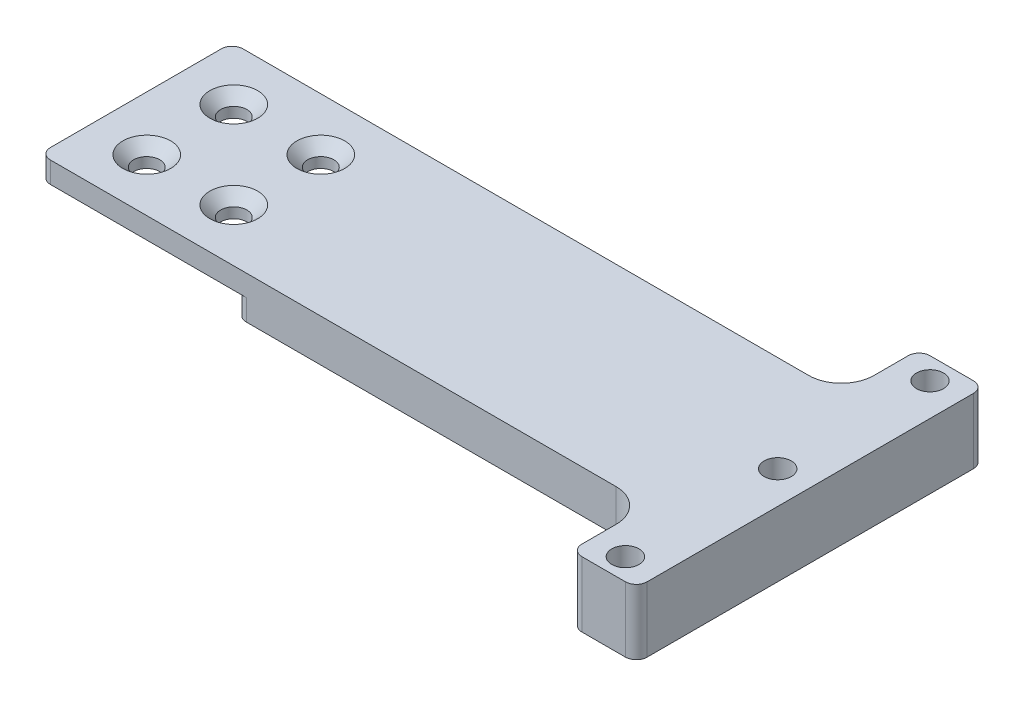
ISO-10303-21;
HEADER;
FILE_DESCRIPTION(('STEP AP214'),'2;1');
FILE_NAME('part.step','',(''),(''),'','','');
FILE_SCHEMA(('AUTOMOTIVE_DESIGN { 1 0 10303 214 1 1 1 1 }'));
ENDSEC;
DATA;
#1=APPLICATION_CONTEXT('core data for automotive mechanical design processes');
#2=APPLICATION_PROTOCOL_DEFINITION('international standard','automotive_design',2000,#1);
#3=PRODUCT_CONTEXT('',#1,'mechanical');
#4=PRODUCT('Part','Part','',(#3));
#5=PRODUCT_RELATED_PRODUCT_CATEGORY('part','',(#4));
#6=PRODUCT_DEFINITION_FORMATION('','',#4);
#7=PRODUCT_DEFINITION_CONTEXT('part definition',#1,'design');
#8=PRODUCT_DEFINITION('design','',#6,#7);
#9=PRODUCT_DEFINITION_SHAPE('','',#8);
#10=(LENGTH_UNIT() NAMED_UNIT(*) SI_UNIT(.MILLI.,.METRE.));
#11=(NAMED_UNIT(*) PLANE_ANGLE_UNIT() SI_UNIT($,.RADIAN.));
#12=(NAMED_UNIT(*) SI_UNIT($,.STERADIAN.) SOLID_ANGLE_UNIT());
#13=UNCERTAINTY_MEASURE_WITH_UNIT(LENGTH_MEASURE(1.E-05),#10,'distance_accuracy_value','');
#14=(GEOMETRIC_REPRESENTATION_CONTEXT(3) GLOBAL_UNCERTAINTY_ASSIGNED_CONTEXT((#13)) GLOBAL_UNIT_ASSIGNED_CONTEXT((#10,
#11,#12)) REPRESENTATION_CONTEXT('',''));
#15=CARTESIAN_POINT('',(0.,0.,0.));
#16=DIRECTION('',(0.,0.,1.));
#17=DIRECTION('',(1.,0.,0.));
#18=AXIS2_PLACEMENT_3D('',#15,#16,#17);
#19=CARTESIAN_POINT('',(-26.,3.9,4.));
#20=DIRECTION('',(0.,1.,0.));
#21=DIRECTION('',(0.,0.,1.));
#22=AXIS2_PLACEMENT_3D('',#19,#20,#21);
#23=CYLINDRICAL_SURFACE('',#22,1.2);
#24=CARTESIAN_POINT('',(-26.,2.9,4.));
#25=DIRECTION('',(0.,1.,0.));
#26=DIRECTION('',(0.,0.,1.));
#27=AXIS2_PLACEMENT_3D('',#24,#25,#26);
#28=CIRCLE('',#27,1.2);
#29=CARTESIAN_POINT('',(-26.,2.9,5.2));
#30=VERTEX_POINT('',#29);
#31=EDGE_CURVE('E213',#30,#30,#28,.T.);
#32=ORIENTED_EDGE('',*,*,#31,.T.);
#33=EDGE_LOOP('',(#32));
#34=FACE_BOUND('',#33,.T.);
#35=CARTESIAN_POINT('',(-26.,1.95,4.));
#36=DIRECTION('',(0.,-1.,0.));
#37=DIRECTION('',(0.,0.,-1.));
#38=AXIS2_PLACEMENT_3D('',#35,#36,#37);
#39=CIRCLE('',#38,1.2);
#40=CARTESIAN_POINT('',(-26.,1.95,2.8));
#41=VERTEX_POINT('',#40);
#42=EDGE_CURVE('E457',#41,#41,#39,.F.);
#43=ORIENTED_EDGE('',*,*,#42,.F.);
#44=EDGE_LOOP('',(#43));
#45=FACE_BOUND('',#44,.T.);
#46=ADVANCED_FACE('F45',(#34,#45),#23,.F.);
#47=CARTESIAN_POINT('',(-18.,3.9,4.));
#48=DIRECTION('',(0.,1.,0.));
#49=DIRECTION('',(0.,0.,1.));
#50=AXIS2_PLACEMENT_3D('',#47,#48,#49);
#51=CYLINDRICAL_SURFACE('',#50,1.2);
#52=CARTESIAN_POINT('',(-18.,2.9,4.));
#53=DIRECTION('',(0.,1.,0.));
#54=DIRECTION('',(0.,0.,1.));
#55=AXIS2_PLACEMENT_3D('',#52,#53,#54);
#56=CIRCLE('',#55,1.2);
#57=CARTESIAN_POINT('',(-18.,2.9,5.2));
#58=VERTEX_POINT('',#57);
#59=EDGE_CURVE('E346',#58,#58,#56,.T.);
#60=ORIENTED_EDGE('',*,*,#59,.T.);
#61=EDGE_LOOP('',(#60));
#62=FACE_BOUND('',#61,.T.);
#63=CARTESIAN_POINT('',(-18.,1.95,4.));
#64=DIRECTION('',(0.,-1.,0.));
#65=DIRECTION('',(0.,0.,-1.));
#66=AXIS2_PLACEMENT_3D('',#63,#64,#65);
#67=CIRCLE('',#66,1.2);
#68=CARTESIAN_POINT('',(-18.,1.95,2.8));
#69=VERTEX_POINT('',#68);
#70=EDGE_CURVE('E454',#69,#69,#67,.F.);
#71=ORIENTED_EDGE('',*,*,#70,.F.);
#72=EDGE_LOOP('',(#71));
#73=FACE_BOUND('',#72,.T.);
#74=ADVANCED_FACE('F367',(#62,#73),#51,.F.);
#75=CARTESIAN_POINT('',(-31.,3.9,11.9));
#76=DIRECTION('',(1.,0.,0.));
#77=DIRECTION('',(0.,0.,-1.));
#78=AXIS2_PLACEMENT_3D('',#75,#76,#77);
#79=PLANE('',#78);
#80=DIRECTION('',(0.,0.,-1.));
#81=VECTOR('',#80,1.);
#82=CARTESIAN_POINT('',(-31.,1.95,9.00000000000001));
#83=LINE('',#82,#81);
#84=CARTESIAN_POINT('',(-31.,1.95,7.85));
#85=VERTEX_POINT('',#84);
#86=CARTESIAN_POINT('',(-31.,1.95,-7.85));
#87=VERTEX_POINT('',#86);
#88=EDGE_CURVE('E209',#85,#87,#83,.T.);
#89=ORIENTED_EDGE('',*,*,#88,.F.);
#90=DIRECTION('',(0.,1.,0.));
#91=VECTOR('',#90,1.);
#92=CARTESIAN_POINT('',(-31.,3.9,7.85));
#93=LINE('',#92,#91);
#94=CARTESIAN_POINT('',(-31.,3.9,7.85));
#95=VERTEX_POINT('',#94);
#96=EDGE_CURVE('E278',#85,#95,#93,.T.);
#97=ORIENTED_EDGE('',*,*,#96,.T.);
#98=DIRECTION('',(0.,0.,1.));
#99=VECTOR('',#98,1.);
#100=CARTESIAN_POINT('',(-31.,3.9,11.9));
#101=LINE('',#100,#99);
#102=CARTESIAN_POINT('',(-31.,3.9,-7.85));
#103=VERTEX_POINT('',#102);
#104=EDGE_CURVE('E327',#103,#95,#101,.T.);
#105=ORIENTED_EDGE('',*,*,#104,.F.);
#106=DIRECTION('',(0.,1.,0.));
#107=VECTOR('',#106,1.);
#108=CARTESIAN_POINT('',(-31.,3.9,-7.85));
#109=LINE('',#108,#107);
#110=EDGE_CURVE('E276',#103,#87,#109,.F.);
#111=ORIENTED_EDGE('',*,*,#110,.T.);
#112=EDGE_LOOP('',(#89,#97,#105,#111));
#113=FACE_BOUND('',#112,.T.);
#114=ADVANCED_FACE('F373',(#113),#79,.F.);
#115=CARTESIAN_POINT('',(-18.,3.9,-4.));
#116=DIRECTION('',(0.,1.,0.));
#117=DIRECTION('',(0.,0.,1.));
#118=AXIS2_PLACEMENT_3D('',#115,#116,#117);
#119=CYLINDRICAL_SURFACE('',#118,1.2);
#120=CARTESIAN_POINT('',(-18.,2.9,-4.));
#121=DIRECTION('',(0.,1.,0.));
#122=DIRECTION('',(0.,0.,1.));
#123=AXIS2_PLACEMENT_3D('',#120,#121,#122);
#124=CIRCLE('',#123,1.2);
#125=CARTESIAN_POINT('',(-18.,2.9,-2.8));
#126=VERTEX_POINT('',#125);
#127=EDGE_CURVE('E469',#126,#126,#124,.T.);
#128=ORIENTED_EDGE('',*,*,#127,.T.);
#129=EDGE_LOOP('',(#128));
#130=FACE_BOUND('',#129,.T.);
#131=CARTESIAN_POINT('',(-18.,1.95,-4.));
#132=DIRECTION('',(0.,-1.,0.));
#133=DIRECTION('',(0.,0.,-1.));
#134=AXIS2_PLACEMENT_3D('',#131,#132,#133);
#135=CIRCLE('',#134,1.2);
#136=CARTESIAN_POINT('',(-18.,1.95,-5.2));
#137=VERTEX_POINT('',#136);
#138=EDGE_CURVE('E451',#137,#137,#135,.F.);
#139=ORIENTED_EDGE('',*,*,#138,.F.);
#140=EDGE_LOOP('',(#139));
#141=FACE_BOUND('',#140,.T.);
#142=ADVANCED_FACE('F515',(#130,#141),#119,.F.);
#143=CARTESIAN_POINT('',(-26.,3.9,-4.));
#144=DIRECTION('',(0.,1.,0.));
#145=DIRECTION('',(0.,0.,1.));
#146=AXIS2_PLACEMENT_3D('',#143,#144,#145);
#147=CYLINDRICAL_SURFACE('',#146,1.2);
#148=CARTESIAN_POINT('',(-26.,2.9,-4.));
#149=DIRECTION('',(0.,1.,0.));
#150=DIRECTION('',(0.,0.,1.));
#151=AXIS2_PLACEMENT_3D('',#148,#149,#150);
#152=CIRCLE('',#151,1.2);
#153=CARTESIAN_POINT('',(-26.,2.9,-2.8));
#154=VERTEX_POINT('',#153);
#155=EDGE_CURVE('E463',#154,#154,#152,.T.);
#156=ORIENTED_EDGE('',*,*,#155,.T.);
#157=EDGE_LOOP('',(#156));
#158=FACE_BOUND('',#157,.T.);
#159=CARTESIAN_POINT('',(-26.,1.95,-4.));
#160=DIRECTION('',(0.,-1.,0.));
#161=DIRECTION('',(0.,0.,-1.));
#162=AXIS2_PLACEMENT_3D('',#159,#160,#161);
#163=CIRCLE('',#162,1.2);
#164=CARTESIAN_POINT('',(-26.,1.95,-5.2));
#165=VERTEX_POINT('',#164);
#166=EDGE_CURVE('E208',#165,#165,#163,.F.);
#167=ORIENTED_EDGE('',*,*,#166,.F.);
#168=EDGE_LOOP('',(#167));
#169=FACE_BOUND('',#168,.T.);
#170=ADVANCED_FACE('F382',(#158,#169),#147,.F.);
#171=CARTESIAN_POINT('',(-26.,3.9,4.));
#172=DIRECTION('',(0.,1.,0.));
#173=DIRECTION('',(0.,0.,1.));
#174=AXIS2_PLACEMENT_3D('',#171,#172,#173);
#175=CONICAL_SURFACE('',#174,2.2,0.785398163397448);
#176=ORIENTED_EDGE('',*,*,#31,.F.);
#177=EDGE_LOOP('',(#176));
#178=FACE_BOUND('',#177,.T.);
#179=CARTESIAN_POINT('',(-26.,3.9,4.));
#180=DIRECTION('',(0.,1.,0.));
#181=DIRECTION('',(0.,0.,1.));
#182=AXIS2_PLACEMENT_3D('',#179,#180,#181);
#183=CIRCLE('',#182,2.2);
#184=CARTESIAN_POINT('',(-26.,3.9,6.2));
#185=VERTEX_POINT('',#184);
#186=EDGE_CURVE('E218',#185,#185,#183,.T.);
#187=ORIENTED_EDGE('',*,*,#186,.T.);
#188=EDGE_LOOP('',(#187));
#189=FACE_BOUND('',#188,.T.);
#190=ADVANCED_FACE('F351',(#178,#189),#175,.F.);
#191=CARTESIAN_POINT('',(-18.,3.9,4.));
#192=DIRECTION('',(0.,1.,0.));
#193=DIRECTION('',(0.,0.,1.));
#194=AXIS2_PLACEMENT_3D('',#191,#192,#193);
#195=CONICAL_SURFACE('',#194,2.2,0.785398163397448);
#196=ORIENTED_EDGE('',*,*,#59,.F.);
#197=EDGE_LOOP('',(#196));
#198=FACE_BOUND('',#197,.T.);
#199=CARTESIAN_POINT('',(-18.,3.9,4.));
#200=DIRECTION('',(0.,1.,0.));
#201=DIRECTION('',(0.,0.,1.));
#202=AXIS2_PLACEMENT_3D('',#199,#200,#201);
#203=CIRCLE('',#202,2.2);
#204=CARTESIAN_POINT('',(-18.,3.9,6.2));
#205=VERTEX_POINT('',#204);
#206=EDGE_CURVE('E343',#205,#205,#203,.T.);
#207=ORIENTED_EDGE('',*,*,#206,.T.);
#208=EDGE_LOOP('',(#207));
#209=FACE_BOUND('',#208,.T.);
#210=ADVANCED_FACE('F379',(#198,#209),#195,.F.);
#211=CARTESIAN_POINT('',(0.,0.,0.));
#212=DIRECTION('',(0.,1.,0.));
#213=DIRECTION('',(0.,0.,1.));
#214=AXIS2_PLACEMENT_3D('',#211,#212,#213);
#215=PLANE('',#214);
#216=DIRECTION('',(0.,0.,-1.));
#217=VECTOR('',#216,1.);
#218=CARTESIAN_POINT('',(25.,0.,11.9));
#219=LINE('',#218,#217);
#220=CARTESIAN_POINT('',(25.,0.,11.85));
#221=VERTEX_POINT('',#220);
#222=CARTESIAN_POINT('',(25.,0.,-11.85));
#223=VERTEX_POINT('',#222);
#224=EDGE_CURVE('E303',#221,#223,#219,.T.);
#225=ORIENTED_EDGE('',*,*,#224,.F.);
#226=CARTESIAN_POINT('',(22.,0.,11.85));
#227=DIRECTION('',(0.,1.,0.));
#228=DIRECTION('',(0.,0.,1.));
#229=AXIS2_PLACEMENT_3D('',#226,#227,#228);
#230=CIRCLE('',#229,3.);
#231=CARTESIAN_POINT('',(22.,0.,8.85));
#232=VERTEX_POINT('',#231);
#233=EDGE_CURVE('E297',#221,#232,#230,.T.);
#234=ORIENTED_EDGE('',*,*,#233,.T.);
#235=DIRECTION('',(-1.,0.,0.));
#236=VECTOR('',#235,1.);
#237=CARTESIAN_POINT('',(0.,0.,8.85));
#238=LINE('',#237,#236);
#239=CARTESIAN_POINT('',(-12.,0.,8.85));
#240=VERTEX_POINT('',#239);
#241=EDGE_CURVE('E302',#232,#240,#238,.T.);
#242=ORIENTED_EDGE('',*,*,#241,.T.);
#243=CARTESIAN_POINT('',(-12.,0.,7.85));
#244=DIRECTION('',(0.,1.,0.));
#245=DIRECTION('',(0.,0.,1.));
#246=AXIS2_PLACEMENT_3D('',#243,#244,#245);
#247=CIRCLE('',#246,1.);
#248=CARTESIAN_POINT('',(-13.,0.,7.85));
#249=VERTEX_POINT('',#248);
#250=EDGE_CURVE('E227',#240,#249,#247,.F.);
#251=ORIENTED_EDGE('',*,*,#250,.T.);
#252=DIRECTION('',(0.,0.,1.));
#253=VECTOR('',#252,1.);
#254=CARTESIAN_POINT('',(-13.,0.,9.00000000000001));
#255=LINE('',#254,#253);
#256=CARTESIAN_POINT('',(-13.,0.,-7.85));
#257=VERTEX_POINT('',#256);
#258=EDGE_CURVE('E445',#257,#249,#255,.T.);
#259=ORIENTED_EDGE('',*,*,#258,.F.);
#260=CARTESIAN_POINT('',(-12.,0.,-7.85));
#261=DIRECTION('',(0.,1.,0.));
#262=DIRECTION('',(0.,0.,1.));
#263=AXIS2_PLACEMENT_3D('',#260,#261,#262);
#264=CIRCLE('',#263,1.);
#265=CARTESIAN_POINT('',(-12.,0.,-8.85));
#266=VERTEX_POINT('',#265);
#267=EDGE_CURVE('E212',#257,#266,#264,.F.);
#268=ORIENTED_EDGE('',*,*,#267,.T.);
#269=DIRECTION('',(1.,0.,0.));
#270=VECTOR('',#269,1.);
#271=CARTESIAN_POINT('',(0.,0.,-8.85));
#272=LINE('',#271,#270);
#273=CARTESIAN_POINT('',(22.,0.,-8.85));
#274=VERTEX_POINT('',#273);
#275=EDGE_CURVE('E423',#266,#274,#272,.T.);
#276=ORIENTED_EDGE('',*,*,#275,.T.);
#277=CARTESIAN_POINT('',(22.,0.,-11.85));
#278=DIRECTION('',(0.,1.,0.));
#279=DIRECTION('',(0.,0.,1.));
#280=AXIS2_PLACEMENT_3D('',#277,#278,#279);
#281=CIRCLE('',#280,3.);
#282=EDGE_CURVE('E11',#274,#223,#281,.T.);
#283=ORIENTED_EDGE('',*,*,#282,.T.);
#284=EDGE_LOOP('',(#225,#234,#242,#251,#259,#268,#276,#283));
#285=FACE_BOUND('',#284,.T.);
#286=ADVANCED_FACE('F301',(#285),#215,.F.);
#287=CARTESIAN_POINT('',(28.,3.9,16.));
#288=DIRECTION('',(0.,0.,-1.));
#289=DIRECTION('',(-1.,0.,0.));
#290=AXIS2_PLACEMENT_3D('',#287,#288,#289);
#291=PLANE('',#290);
#292=DIRECTION('',(-1.,0.,0.));
#293=VECTOR('',#292,1.);
#294=CARTESIAN_POINT('',(28.,-2.1,16.));
#295=LINE('',#294,#293);
#296=CARTESIAN_POINT('',(30.,-2.1,16.));
#297=VERTEX_POINT('',#296);
#298=CARTESIAN_POINT('',(26.,-2.1,16.));
#299=VERTEX_POINT('',#298);
#300=EDGE_CURVE('E333',#297,#299,#295,.T.);
#301=ORIENTED_EDGE('',*,*,#300,.F.);
#302=DIRECTION('',(0.,-1.,0.));
#303=VECTOR('',#302,1.);
#304=CARTESIAN_POINT('',(30.,3.9,16.));
#305=LINE('',#304,#303);
#306=CARTESIAN_POINT('',(30.,3.9,16.));
#307=VERTEX_POINT('',#306);
#308=EDGE_CURVE('E274',#297,#307,#305,.F.);
#309=ORIENTED_EDGE('',*,*,#308,.T.);
#310=DIRECTION('',(1.,0.,0.));
#311=VECTOR('',#310,1.);
#312=CARTESIAN_POINT('',(25.,3.9,16.));
#313=LINE('',#312,#311);
#314=CARTESIAN_POINT('',(26.,3.9,16.));
#315=VERTEX_POINT('',#314);
#316=EDGE_CURVE('E326',#315,#307,#313,.T.);
#317=ORIENTED_EDGE('',*,*,#316,.F.);
#318=DIRECTION('',(0.,-1.,0.));
#319=VECTOR('',#318,1.);
#320=CARTESIAN_POINT('',(26.,3.9,16.));
#321=LINE('',#320,#319);
#322=EDGE_CURVE('E271',#315,#299,#321,.T.);
#323=ORIENTED_EDGE('',*,*,#322,.T.);
#324=EDGE_LOOP('',(#301,#309,#317,#323));
#325=FACE_BOUND('',#324,.T.);
#326=ADVANCED_FACE('F493',(#325),#291,.F.);
#327=CARTESIAN_POINT('',(31.,3.9,-16.));
#328=DIRECTION('',(-1.,0.,0.));
#329=DIRECTION('',(0.,0.,1.));
#330=AXIS2_PLACEMENT_3D('',#327,#328,#329);
#331=PLANE('',#330);
#332=DIRECTION('',(0.,0.,1.));
#333=VECTOR('',#332,1.);
#334=CARTESIAN_POINT('',(31.,-2.1,16.));
#335=LINE('',#334,#333);
#336=CARTESIAN_POINT('',(31.,-2.1,-15.));
#337=VERTEX_POINT('',#336);
#338=CARTESIAN_POINT('',(31.,-2.1,15.));
#339=VERTEX_POINT('',#338);
#340=EDGE_CURVE('E478',#337,#339,#335,.T.);
#341=ORIENTED_EDGE('',*,*,#340,.F.);
#342=DIRECTION('',(0.,-1.,0.));
#343=VECTOR('',#342,1.);
#344=CARTESIAN_POINT('',(31.,3.9,-15.));
#345=LINE('',#344,#343);
#346=CARTESIAN_POINT('',(31.,3.9,-15.));
#347=VERTEX_POINT('',#346);
#348=EDGE_CURVE('E269',#337,#347,#345,.F.);
#349=ORIENTED_EDGE('',*,*,#348,.T.);
#350=DIRECTION('',(0.,0.,-1.));
#351=VECTOR('',#350,1.);
#352=CARTESIAN_POINT('',(31.,3.9,-16.));
#353=LINE('',#352,#351);
#354=CARTESIAN_POINT('',(31.,3.9,15.));
#355=VERTEX_POINT('',#354);
#356=EDGE_CURVE('E330',#355,#347,#353,.T.);
#357=ORIENTED_EDGE('',*,*,#356,.F.);
#358=DIRECTION('',(0.,-1.,0.));
#359=VECTOR('',#358,1.);
#360=CARTESIAN_POINT('',(31.,3.9,15.));
#361=LINE('',#360,#359);
#362=EDGE_CURVE('E266',#355,#339,#361,.T.);
#363=ORIENTED_EDGE('',*,*,#362,.T.);
#364=EDGE_LOOP('',(#341,#349,#357,#363));
#365=FACE_BOUND('',#364,.T.);
#366=ADVANCED_FACE('F500',(#365),#331,.F.);
#367=CARTESIAN_POINT('',(25.,3.9,-16.));
#368=DIRECTION('',(0.,0.,1.));
#369=DIRECTION('',(1.,0.,0.));
#370=AXIS2_PLACEMENT_3D('',#367,#368,#369);
#371=PLANE('',#370);
#372=DIRECTION('',(1.,0.,0.));
#373=VECTOR('',#372,1.);
#374=CARTESIAN_POINT('',(25.,-2.1,-16.));
#375=LINE('',#374,#373);
#376=CARTESIAN_POINT('',(26.,-2.1,-16.));
#377=VERTEX_POINT('',#376);
#378=CARTESIAN_POINT('',(30.,-2.1,-16.));
#379=VERTEX_POINT('',#378);
#380=EDGE_CURVE('E475',#377,#379,#375,.T.);
#381=ORIENTED_EDGE('',*,*,#380,.F.);
#382=DIRECTION('',(0.,-1.,0.));
#383=VECTOR('',#382,1.);
#384=CARTESIAN_POINT('',(26.,3.9,-16.));
#385=LINE('',#384,#383);
#386=CARTESIAN_POINT('',(26.,3.9,-16.));
#387=VERTEX_POINT('',#386);
#388=EDGE_CURVE('E251',#377,#387,#385,.F.);
#389=ORIENTED_EDGE('',*,*,#388,.T.);
#390=DIRECTION('',(-1.,0.,0.));
#391=VECTOR('',#390,1.);
#392=CARTESIAN_POINT('',(28.,3.9,-16.));
#393=LINE('',#392,#391);
#394=CARTESIAN_POINT('',(30.,3.9,-16.));
#395=VERTEX_POINT('',#394);
#396=EDGE_CURVE('E339',#395,#387,#393,.T.);
#397=ORIENTED_EDGE('',*,*,#396,.F.);
#398=DIRECTION('',(0.,-1.,0.));
#399=VECTOR('',#398,1.);
#400=CARTESIAN_POINT('',(30.,3.9,-16.));
#401=LINE('',#400,#399);
#402=EDGE_CURVE('E248',#395,#379,#401,.T.);
#403=ORIENTED_EDGE('',*,*,#402,.T.);
#404=EDGE_LOOP('',(#381,#389,#397,#403));
#405=FACE_BOUND('',#404,.T.);
#406=ADVANCED_FACE('F363',(#405),#371,.F.);
#407=CARTESIAN_POINT('',(25.,3.9,-11.9));
#408=DIRECTION('',(1.,0.,0.));
#409=DIRECTION('',(0.,0.,-1.));
#410=AXIS2_PLACEMENT_3D('',#407,#408,#409);
#411=PLANE('',#410);
#412=DIRECTION('',(0.,0.,1.));
#413=VECTOR('',#412,1.);
#414=CARTESIAN_POINT('',(25.,3.9,11.9));
#415=LINE('',#414,#413);
#416=CARTESIAN_POINT('',(25.,3.9,11.85));
#417=VERTEX_POINT('',#416);
#418=CARTESIAN_POINT('',(25.,3.9,15.));
#419=VERTEX_POINT('',#418);
#420=EDGE_CURVE('E319',#417,#419,#415,.T.);
#421=ORIENTED_EDGE('',*,*,#420,.F.);
#422=DIRECTION('',(0.,1.,0.));
#423=VECTOR('',#422,1.);
#424=CARTESIAN_POINT('',(25.,0.,11.85));
#425=LINE('',#424,#423);
#426=EDGE_CURVE('E291',#417,#221,#425,.F.);
#427=ORIENTED_EDGE('',*,*,#426,.T.);
#428=ORIENTED_EDGE('',*,*,#224,.T.);
#429=DIRECTION('',(0.,1.,0.));
#430=VECTOR('',#429,1.);
#431=CARTESIAN_POINT('',(25.,3.9,-11.85));
#432=LINE('',#431,#430);
#433=CARTESIAN_POINT('',(25.,3.9,-11.85));
#434=VERTEX_POINT('',#433);
#435=EDGE_CURVE('E288',#223,#434,#432,.T.);
#436=ORIENTED_EDGE('',*,*,#435,.T.);
#437=DIRECTION('',(0.,0.,1.));
#438=VECTOR('',#437,1.);
#439=CARTESIAN_POINT('',(25.,3.9,-11.9));
#440=LINE('',#439,#438);
#441=CARTESIAN_POINT('',(25.,3.9,-15.));
#442=VERTEX_POINT('',#441);
#443=EDGE_CURVE('E341',#442,#434,#440,.T.);
#444=ORIENTED_EDGE('',*,*,#443,.F.);
#445=DIRECTION('',(0.,-1.,0.));
#446=VECTOR('',#445,1.);
#447=CARTESIAN_POINT('',(25.,3.9,-15.));
#448=LINE('',#447,#446);
#449=CARTESIAN_POINT('',(25.,-2.1,-15.));
#450=VERTEX_POINT('',#449);
#451=EDGE_CURVE('E237',#442,#450,#448,.T.);
#452=ORIENTED_EDGE('',*,*,#451,.T.);
#453=DIRECTION('',(0.,0.,-1.));
#454=VECTOR('',#453,1.);
#455=CARTESIAN_POINT('',(25.,-2.1,11.9));
#456=LINE('',#455,#454);
#457=CARTESIAN_POINT('',(25.,-2.1,15.));
#458=VERTEX_POINT('',#457);
#459=EDGE_CURVE('E472',#458,#450,#456,.T.);
#460=ORIENTED_EDGE('',*,*,#459,.F.);
#461=DIRECTION('',(0.,-1.,0.));
#462=VECTOR('',#461,1.);
#463=CARTESIAN_POINT('',(25.,3.9,15.));
#464=LINE('',#463,#462);
#465=EDGE_CURVE('E234',#458,#419,#464,.F.);
#466=ORIENTED_EDGE('',*,*,#465,.T.);
#467=EDGE_LOOP('',(#421,#427,#428,#436,#444,#452,#460,#466));
#468=FACE_BOUND('',#467,.T.);
#469=ADVANCED_FACE('F322',(#468),#411,.F.);
#470=CARTESIAN_POINT('',(0.,3.9,0.));
#471=DIRECTION('',(0.,1.,0.));
#472=DIRECTION('',(0.,0.,1.));
#473=AXIS2_PLACEMENT_3D('',#470,#471,#472);
#474=PLANE('',#473);
#475=ORIENTED_EDGE('',*,*,#396,.T.);
#476=CARTESIAN_POINT('',(26.,3.9,-15.));
#477=DIRECTION('',(0.,1.,0.));
#478=DIRECTION('',(0.,0.,1.));
#479=AXIS2_PLACEMENT_3D('',#476,#477,#478);
#480=CIRCLE('',#479,1.);
#481=EDGE_CURVE('E264',#387,#442,#480,.T.);
#482=ORIENTED_EDGE('',*,*,#481,.T.);
#483=ORIENTED_EDGE('',*,*,#443,.T.);
#484=CARTESIAN_POINT('',(22.,3.9,-11.85));
#485=DIRECTION('',(0.,1.,0.));
#486=DIRECTION('',(0.,0.,1.));
#487=AXIS2_PLACEMENT_3D('',#484,#485,#486);
#488=CIRCLE('',#487,3.);
#489=CARTESIAN_POINT('',(22.,3.9,-8.85));
#490=VERTEX_POINT('',#489);
#491=EDGE_CURVE('E53',#434,#490,#488,.F.);
#492=ORIENTED_EDGE('',*,*,#491,.T.);
#493=DIRECTION('',(1.,0.,0.));
#494=VECTOR('',#493,1.);
#495=CARTESIAN_POINT('',(-31.,3.9,-8.85));
#496=LINE('',#495,#494);
#497=CARTESIAN_POINT('',(-30.,3.9,-8.85));
#498=VERTEX_POINT('',#497);
#499=EDGE_CURVE('E530',#498,#490,#496,.T.);
#500=ORIENTED_EDGE('',*,*,#499,.F.);
#501=CARTESIAN_POINT('',(-30.,3.9,-7.85));
#502=DIRECTION('',(0.,1.,0.));
#503=DIRECTION('',(0.,0.,1.));
#504=AXIS2_PLACEMENT_3D('',#501,#502,#503);
#505=CIRCLE('',#504,1.);
#506=EDGE_CURVE('E253',#498,#103,#505,.T.);
#507=ORIENTED_EDGE('',*,*,#506,.T.);
#508=ORIENTED_EDGE('',*,*,#104,.T.);
#509=CARTESIAN_POINT('',(-30.,3.9,7.85));
#510=DIRECTION('',(0.,1.,0.));
#511=DIRECTION('',(0.,0.,1.));
#512=AXIS2_PLACEMENT_3D('',#509,#510,#511);
#513=CIRCLE('',#512,1.);
#514=CARTESIAN_POINT('',(-30.,3.9,8.85));
#515=VERTEX_POINT('',#514);
#516=EDGE_CURVE('E255',#95,#515,#513,.T.);
#517=ORIENTED_EDGE('',*,*,#516,.T.);
#518=DIRECTION('',(-1.,0.,0.));
#519=VECTOR('',#518,1.);
#520=CARTESIAN_POINT('',(-31.,3.9,8.85));
#521=LINE('',#520,#519);
#522=CARTESIAN_POINT('',(22.,3.9,8.85));
#523=VERTEX_POINT('',#522);
#524=EDGE_CURVE('E320',#523,#515,#521,.T.);
#525=ORIENTED_EDGE('',*,*,#524,.F.);
#526=CARTESIAN_POINT('',(22.,3.9,11.85));
#527=DIRECTION('',(0.,1.,0.));
#528=DIRECTION('',(0.,0.,1.));
#529=AXIS2_PLACEMENT_3D('',#526,#527,#528);
#530=CIRCLE('',#529,3.);
#531=EDGE_CURVE('E295',#523,#417,#530,.F.);
#532=ORIENTED_EDGE('',*,*,#531,.T.);
#533=ORIENTED_EDGE('',*,*,#420,.T.);
#534=CARTESIAN_POINT('',(26.,3.9,15.));
#535=DIRECTION('',(0.,1.,0.));
#536=DIRECTION('',(0.,0.,1.));
#537=AXIS2_PLACEMENT_3D('',#534,#535,#536);
#538=CIRCLE('',#537,1.);
#539=EDGE_CURVE('E258',#419,#315,#538,.T.);
#540=ORIENTED_EDGE('',*,*,#539,.T.);
#541=ORIENTED_EDGE('',*,*,#316,.T.);
#542=CARTESIAN_POINT('',(30.,3.9,15.));
#543=DIRECTION('',(0.,1.,0.));
#544=DIRECTION('',(0.,0.,1.));
#545=AXIS2_PLACEMENT_3D('',#542,#543,#544);
#546=CIRCLE('',#545,1.);
#547=EDGE_CURVE('E260',#307,#355,#546,.T.);
#548=ORIENTED_EDGE('',*,*,#547,.T.);
#549=ORIENTED_EDGE('',*,*,#356,.T.);
#550=CARTESIAN_POINT('',(30.,3.9,-15.));
#551=DIRECTION('',(0.,1.,0.));
#552=DIRECTION('',(0.,0.,1.));
#553=AXIS2_PLACEMENT_3D('',#550,#551,#552);
#554=CIRCLE('',#553,1.);
#555=EDGE_CURVE('E262',#347,#395,#554,.T.);
#556=ORIENTED_EDGE('',*,*,#555,.T.);
#557=EDGE_LOOP('',(#475,#482,#483,#492,#500,#507,#508,#517,#525,#532,#533,#540,#541,#548,#549,#556));
#558=FACE_BOUND('',#557,.T.);
#559=CARTESIAN_POINT('',(28.,3.9,-14.));
#560=DIRECTION('',(0.,1.,0.));
#561=DIRECTION('',(0.,0.,1.));
#562=AXIS2_PLACEMENT_3D('',#559,#560,#561);
#563=CIRCLE('',#562,1.24999999999999);
#564=CARTESIAN_POINT('',(28.,3.9,-12.75));
#565=VERTEX_POINT('',#564);
#566=EDGE_CURVE('E424',#565,#565,#563,.T.);
#567=ORIENTED_EDGE('',*,*,#566,.F.);
#568=EDGE_LOOP('',(#567));
#569=FACE_BOUND('',#568,.T.);
#570=CARTESIAN_POINT('',(28.,3.9,14.));
#571=DIRECTION('',(0.,1.,0.));
#572=DIRECTION('',(0.,0.,1.));
#573=AXIS2_PLACEMENT_3D('',#570,#571,#572);
#574=CIRCLE('',#573,1.24999999999999);
#575=CARTESIAN_POINT('',(28.,3.9,15.25));
#576=VERTEX_POINT('',#575);
#577=EDGE_CURVE('E433',#576,#576,#574,.T.);
#578=ORIENTED_EDGE('',*,*,#577,.F.);
#579=EDGE_LOOP('',(#578));
#580=FACE_BOUND('',#579,.T.);
#581=CARTESIAN_POINT('',(28.,3.9,0.));
#582=DIRECTION('',(0.,1.,0.));
#583=DIRECTION('',(0.,0.,1.));
#584=AXIS2_PLACEMENT_3D('',#581,#582,#583);
#585=CIRCLE('',#584,1.24999999999999);
#586=CARTESIAN_POINT('',(28.,3.9,1.24999999999999));
#587=VERTEX_POINT('',#586);
#588=EDGE_CURVE('E439',#587,#587,#585,.T.);
#589=ORIENTED_EDGE('',*,*,#588,.F.);
#590=EDGE_LOOP('',(#589));
#591=FACE_BOUND('',#590,.T.);
#592=CARTESIAN_POINT('',(-26.,3.9,-4.));
#593=DIRECTION('',(0.,1.,0.));
#594=DIRECTION('',(0.,0.,1.));
#595=AXIS2_PLACEMENT_3D('',#592,#593,#594);
#596=CIRCLE('',#595,2.2);
#597=CARTESIAN_POINT('',(-26.,3.9,-1.8));
#598=VERTEX_POINT('',#597);
#599=EDGE_CURVE('E460',#598,#598,#596,.T.);
#600=ORIENTED_EDGE('',*,*,#599,.F.);
#601=EDGE_LOOP('',(#600));
#602=FACE_BOUND('',#601,.T.);
#603=CARTESIAN_POINT('',(-18.,3.9,-4.));
#604=DIRECTION('',(0.,1.,0.));
#605=DIRECTION('',(0.,0.,1.));
#606=AXIS2_PLACEMENT_3D('',#603,#604,#605);
#607=CIRCLE('',#606,2.2);
#608=CARTESIAN_POINT('',(-18.,3.9,-1.8));
#609=VERTEX_POINT('',#608);
#610=EDGE_CURVE('E466',#609,#609,#607,.T.);
#611=ORIENTED_EDGE('',*,*,#610,.F.);
#612=EDGE_LOOP('',(#611));
#613=FACE_BOUND('',#612,.T.);
#614=ORIENTED_EDGE('',*,*,#206,.F.);
#615=EDGE_LOOP('',(#614));
#616=FACE_BOUND('',#615,.T.);
#617=ORIENTED_EDGE('',*,*,#186,.F.);
#618=EDGE_LOOP('',(#617));
#619=FACE_BOUND('',#618,.T.);
#620=ADVANCED_FACE('F317',(#558,#569,#580,#591,#602,#613,#616,#619),#474,.T.);
#621=CARTESIAN_POINT('',(0.,-2.1,0.));
#622=DIRECTION('',(0.,-1.,0.));
#623=DIRECTION('',(0.,0.,-1.));
#624=AXIS2_PLACEMENT_3D('',#621,#622,#623);
#625=PLANE('',#624);
#626=CARTESIAN_POINT('',(28.,-2.1,-14.));
#627=DIRECTION('',(0.,-1.,0.));
#628=DIRECTION('',(0.,0.,-1.));
#629=AXIS2_PLACEMENT_3D('',#626,#627,#628);
#630=CIRCLE('',#629,1.24999999999999);
#631=CARTESIAN_POINT('',(28.,-2.1,-15.25));
#632=VERTEX_POINT('',#631);
#633=EDGE_CURVE('E427',#632,#632,#630,.T.);
#634=ORIENTED_EDGE('',*,*,#633,.F.);
#635=EDGE_LOOP('',(#634));
#636=FACE_BOUND('',#635,.T.);
#637=CARTESIAN_POINT('',(28.,-2.1,14.));
#638=DIRECTION('',(0.,-1.,0.));
#639=DIRECTION('',(0.,0.,-1.));
#640=AXIS2_PLACEMENT_3D('',#637,#638,#639);
#641=CIRCLE('',#640,1.24999999999999);
#642=CARTESIAN_POINT('',(28.,-2.1,12.75));
#643=VERTEX_POINT('',#642);
#644=EDGE_CURVE('E436',#643,#643,#641,.T.);
#645=ORIENTED_EDGE('',*,*,#644,.F.);
#646=EDGE_LOOP('',(#645));
#647=FACE_BOUND('',#646,.T.);
#648=CARTESIAN_POINT('',(28.,-2.1,0.));
#649=DIRECTION('',(0.,-1.,0.));
#650=DIRECTION('',(0.,0.,-1.));
#651=AXIS2_PLACEMENT_3D('',#648,#649,#650);
#652=CIRCLE('',#651,1.24999999999999);
#653=CARTESIAN_POINT('',(28.,-2.1,-1.24999999999999));
#654=VERTEX_POINT('',#653);
#655=EDGE_CURVE('E442',#654,#654,#652,.T.);
#656=ORIENTED_EDGE('',*,*,#655,.F.);
#657=EDGE_LOOP('',(#656));
#658=FACE_BOUND('',#657,.T.);
#659=ORIENTED_EDGE('',*,*,#459,.T.);
#660=CARTESIAN_POINT('',(26.,-2.1,-15.));
#661=DIRECTION('',(0.,-1.,0.));
#662=DIRECTION('',(0.,0.,-1.));
#663=AXIS2_PLACEMENT_3D('',#660,#661,#662);
#664=CIRCLE('',#663,1.);
#665=EDGE_CURVE('E246',#450,#377,#664,.T.);
#666=ORIENTED_EDGE('',*,*,#665,.T.);
#667=ORIENTED_EDGE('',*,*,#380,.T.);
#668=CARTESIAN_POINT('',(30.,-2.1,-15.));
#669=DIRECTION('',(0.,-1.,0.));
#670=DIRECTION('',(0.,0.,-1.));
#671=AXIS2_PLACEMENT_3D('',#668,#669,#670);
#672=CIRCLE('',#671,1.);
#673=EDGE_CURVE('E244',#379,#337,#672,.T.);
#674=ORIENTED_EDGE('',*,*,#673,.T.);
#675=ORIENTED_EDGE('',*,*,#340,.T.);
#676=CARTESIAN_POINT('',(30.,-2.1,15.));
#677=DIRECTION('',(0.,-1.,0.));
#678=DIRECTION('',(0.,0.,-1.));
#679=AXIS2_PLACEMENT_3D('',#676,#677,#678);
#680=CIRCLE('',#679,1.);
#681=EDGE_CURVE('E242',#339,#297,#680,.T.);
#682=ORIENTED_EDGE('',*,*,#681,.T.);
#683=ORIENTED_EDGE('',*,*,#300,.T.);
#684=CARTESIAN_POINT('',(26.,-2.1,15.));
#685=DIRECTION('',(0.,-1.,0.));
#686=DIRECTION('',(0.,0.,-1.));
#687=AXIS2_PLACEMENT_3D('',#684,#685,#686);
#688=CIRCLE('',#687,1.);
#689=EDGE_CURVE('E240',#299,#458,#688,.T.);
#690=ORIENTED_EDGE('',*,*,#689,.T.);
#691=EDGE_LOOP('',(#659,#666,#667,#674,#675,#682,#683,#690));
#692=FACE_BOUND('',#691,.T.);
#693=ADVANCED_FACE('F354',(#636,#647,#658,#692),#625,.T.);
#694=CARTESIAN_POINT('',(-18.,3.9,-4.));
#695=DIRECTION('',(0.,1.,0.));
#696=DIRECTION('',(0.,0.,1.));
#697=AXIS2_PLACEMENT_3D('',#694,#695,#696);
#698=CONICAL_SURFACE('',#697,2.2,0.785398163397448);
#699=ORIENTED_EDGE('',*,*,#127,.F.);
#700=EDGE_LOOP('',(#699));
#701=FACE_BOUND('',#700,.T.);
#702=ORIENTED_EDGE('',*,*,#610,.T.);
#703=EDGE_LOOP('',(#702));
#704=FACE_BOUND('',#703,.T.);
#705=ADVANCED_FACE('F360',(#701,#704),#698,.F.);
#706=CARTESIAN_POINT('',(-26.,3.9,-4.));
#707=DIRECTION('',(0.,1.,0.));
#708=DIRECTION('',(0.,0.,1.));
#709=AXIS2_PLACEMENT_3D('',#706,#707,#708);
#710=CONICAL_SURFACE('',#709,2.2,0.785398163397448);
#711=ORIENTED_EDGE('',*,*,#155,.F.);
#712=EDGE_LOOP('',(#711));
#713=FACE_BOUND('',#712,.T.);
#714=ORIENTED_EDGE('',*,*,#599,.T.);
#715=EDGE_LOOP('',(#714));
#716=FACE_BOUND('',#715,.T.);
#717=ADVANCED_FACE('F555',(#713,#716),#710,.F.);
#718=CARTESIAN_POINT('',(0.,1.95,0.));
#719=DIRECTION('',(0.,-1.,0.));
#720=DIRECTION('',(0.,0.,-1.));
#721=AXIS2_PLACEMENT_3D('',#718,#719,#720);
#722=PLANE('',#721);
#723=DIRECTION('',(1.,0.,0.));
#724=VECTOR('',#723,1.);
#725=CARTESIAN_POINT('',(0.,1.95,8.85));
#726=LINE('',#725,#724);
#727=CARTESIAN_POINT('',(-30.,1.95,8.85));
#728=VERTEX_POINT('',#727);
#729=CARTESIAN_POINT('',(-12.,1.95,8.85));
#730=VERTEX_POINT('',#729);
#731=EDGE_CURVE('E312',#728,#730,#726,.T.);
#732=ORIENTED_EDGE('',*,*,#731,.F.);
#733=CARTESIAN_POINT('',(-30.,1.95,7.85));
#734=DIRECTION('',(0.,-1.,0.));
#735=DIRECTION('',(0.,0.,-1.));
#736=AXIS2_PLACEMENT_3D('',#733,#734,#735);
#737=CIRCLE('',#736,1.);
#738=EDGE_CURVE('E283',#728,#85,#737,.T.);
#739=ORIENTED_EDGE('',*,*,#738,.T.);
#740=ORIENTED_EDGE('',*,*,#88,.T.);
#741=CARTESIAN_POINT('',(-30.,1.95,-7.85));
#742=DIRECTION('',(0.,-1.,0.));
#743=DIRECTION('',(0.,0.,-1.));
#744=AXIS2_PLACEMENT_3D('',#741,#742,#743);
#745=CIRCLE('',#744,1.);
#746=CARTESIAN_POINT('',(-30.,1.95,-8.85));
#747=VERTEX_POINT('',#746);
#748=EDGE_CURVE('E281',#87,#747,#745,.T.);
#749=ORIENTED_EDGE('',*,*,#748,.T.);
#750=DIRECTION('',(-1.,0.,0.));
#751=VECTOR('',#750,1.);
#752=CARTESIAN_POINT('',(0.,1.95,-8.85));
#753=LINE('',#752,#751);
#754=CARTESIAN_POINT('',(-12.,1.95,-8.85));
#755=VERTEX_POINT('',#754);
#756=EDGE_CURVE('E191',#755,#747,#753,.T.);
#757=ORIENTED_EDGE('',*,*,#756,.F.);
#758=CARTESIAN_POINT('',(-12.,1.95,-7.85));
#759=DIRECTION('',(0.,-1.,0.));
#760=DIRECTION('',(0.,0.,-1.));
#761=AXIS2_PLACEMENT_3D('',#758,#759,#760);
#762=CIRCLE('',#761,1.);
#763=CARTESIAN_POINT('',(-13.,1.95,-7.85));
#764=VERTEX_POINT('',#763);
#765=EDGE_CURVE('E183',#755,#764,#762,.F.);
#766=ORIENTED_EDGE('',*,*,#765,.T.);
#767=DIRECTION('',(0.,0.,1.));
#768=VECTOR('',#767,1.);
#769=CARTESIAN_POINT('',(-13.,1.95,9.00000000000001));
#770=LINE('',#769,#768);
#771=CARTESIAN_POINT('',(-13.,1.95,7.85));
#772=VERTEX_POINT('',#771);
#773=EDGE_CURVE('E189',#764,#772,#770,.T.);
#774=ORIENTED_EDGE('',*,*,#773,.T.);
#775=CARTESIAN_POINT('',(-12.,1.95,7.85));
#776=DIRECTION('',(0.,-1.,0.));
#777=DIRECTION('',(0.,0.,-1.));
#778=AXIS2_PLACEMENT_3D('',#775,#776,#777);
#779=CIRCLE('',#778,1.);
#780=EDGE_CURVE('E197',#772,#730,#779,.F.);
#781=ORIENTED_EDGE('',*,*,#780,.T.);
#782=EDGE_LOOP('',(#732,#739,#740,#749,#757,#766,#774,#781));
#783=FACE_BOUND('',#782,.T.);
#784=ORIENTED_EDGE('',*,*,#166,.T.);
#785=EDGE_LOOP('',(#784));
#786=FACE_BOUND('',#785,.T.);
#787=ORIENTED_EDGE('',*,*,#138,.T.);
#788=EDGE_LOOP('',(#787));
#789=FACE_BOUND('',#788,.T.);
#790=ORIENTED_EDGE('',*,*,#70,.T.);
#791=EDGE_LOOP('',(#790));
#792=FACE_BOUND('',#791,.T.);
#793=ORIENTED_EDGE('',*,*,#42,.T.);
#794=EDGE_LOOP('',(#793));
#795=FACE_BOUND('',#794,.T.);
#796=ADVANCED_FACE('F186',(#783,#786,#789,#792,#795),#722,.T.);
#797=CARTESIAN_POINT('',(-13.,1.95,9.00000000000001));
#798=DIRECTION('',(1.,0.,0.));
#799=DIRECTION('',(0.,0.,-1.));
#800=AXIS2_PLACEMENT_3D('',#797,#798,#799);
#801=PLANE('',#800);
#802=ORIENTED_EDGE('',*,*,#258,.T.);
#803=DIRECTION('',(0.,1.,0.));
#804=VECTOR('',#803,1.);
#805=CARTESIAN_POINT('',(-13.,1.95,7.85));
#806=LINE('',#805,#804);
#807=EDGE_CURVE('E207',#249,#772,#806,.T.);
#808=ORIENTED_EDGE('',*,*,#807,.T.);
#809=ORIENTED_EDGE('',*,*,#773,.F.);
#810=DIRECTION('',(0.,-1.,0.));
#811=VECTOR('',#810,1.);
#812=CARTESIAN_POINT('',(-13.,1.95,-7.85));
#813=LINE('',#812,#811);
#814=EDGE_CURVE('E204',#764,#257,#813,.T.);
#815=ORIENTED_EDGE('',*,*,#814,.T.);
#816=EDGE_LOOP('',(#802,#808,#809,#815));
#817=FACE_BOUND('',#816,.T.);
#818=ADVANCED_FACE('F203',(#817),#801,.F.);
#819=CARTESIAN_POINT('',(28.,3.9,0.));
#820=DIRECTION('',(0.,1.,0.));
#821=DIRECTION('',(0.,0.,1.));
#822=AXIS2_PLACEMENT_3D('',#819,#820,#821);
#823=CYLINDRICAL_SURFACE('',#822,1.24999999999999);
#824=ORIENTED_EDGE('',*,*,#655,.T.);
#825=EDGE_LOOP('',(#824));
#826=FACE_BOUND('',#825,.T.);
#827=ORIENTED_EDGE('',*,*,#588,.T.);
#828=EDGE_LOOP('',(#827));
#829=FACE_BOUND('',#828,.T.);
#830=ADVANCED_FACE('F548',(#826,#829),#823,.F.);
#831=CARTESIAN_POINT('',(28.,3.9,14.));
#832=DIRECTION('',(0.,1.,0.));
#833=DIRECTION('',(0.,0.,1.));
#834=AXIS2_PLACEMENT_3D('',#831,#832,#833);
#835=CYLINDRICAL_SURFACE('',#834,1.24999999999999);
#836=ORIENTED_EDGE('',*,*,#644,.T.);
#837=EDGE_LOOP('',(#836));
#838=FACE_BOUND('',#837,.T.);
#839=ORIENTED_EDGE('',*,*,#577,.T.);
#840=EDGE_LOOP('',(#839));
#841=FACE_BOUND('',#840,.T.);
#842=ADVANCED_FACE('F544',(#838,#841),#835,.F.);
#843=CARTESIAN_POINT('',(28.,3.9,-14.));
#844=DIRECTION('',(0.,1.,0.));
#845=DIRECTION('',(0.,0.,1.));
#846=AXIS2_PLACEMENT_3D('',#843,#844,#845);
#847=CYLINDRICAL_SURFACE('',#846,1.24999999999999);
#848=ORIENTED_EDGE('',*,*,#633,.T.);
#849=EDGE_LOOP('',(#848));
#850=FACE_BOUND('',#849,.T.);
#851=ORIENTED_EDGE('',*,*,#566,.T.);
#852=EDGE_LOOP('',(#851));
#853=FACE_BOUND('',#852,.T.);
#854=ADVANCED_FACE('F539',(#850,#853),#847,.F.);
#855=CARTESIAN_POINT('',(-31.,-2.1,8.85));
#856=DIRECTION('',(0.,0.,-1.));
#857=DIRECTION('',(-1.,0.,0.));
#858=AXIS2_PLACEMENT_3D('',#855,#856,#857);
#859=PLANE('',#858);
#860=ORIENTED_EDGE('',*,*,#241,.F.);
#861=DIRECTION('',(0.,1.,0.));
#862=VECTOR('',#861,1.);
#863=CARTESIAN_POINT('',(22.,3.9,8.85));
#864=LINE('',#863,#862);
#865=EDGE_CURVE('E196',#232,#523,#864,.T.);
#866=ORIENTED_EDGE('',*,*,#865,.T.);
#867=ORIENTED_EDGE('',*,*,#524,.T.);
#868=DIRECTION('',(0.,1.,0.));
#869=VECTOR('',#868,1.);
#870=CARTESIAN_POINT('',(-30.,-2.1,8.85));
#871=LINE('',#870,#869);
#872=EDGE_CURVE('E215',#515,#728,#871,.F.);
#873=ORIENTED_EDGE('',*,*,#872,.T.);
#874=ORIENTED_EDGE('',*,*,#731,.T.);
#875=DIRECTION('',(0.,1.,0.));
#876=VECTOR('',#875,1.);
#877=CARTESIAN_POINT('',(-12.,-2.1,8.85));
#878=LINE('',#877,#876);
#879=EDGE_CURVE('E223',#730,#240,#878,.F.);
#880=ORIENTED_EDGE('',*,*,#879,.T.);
#881=EDGE_LOOP('',(#860,#866,#867,#873,#874,#880));
#882=FACE_BOUND('',#881,.T.);
#883=ADVANCED_FACE('F308',(#882),#859,.F.);
#884=CARTESIAN_POINT('',(-31.,-2.1,-8.85));
#885=DIRECTION('',(0.,0.,1.));
#886=DIRECTION('',(1.,0.,0.));
#887=AXIS2_PLACEMENT_3D('',#884,#885,#886);
#888=PLANE('',#887);
#889=ORIENTED_EDGE('',*,*,#499,.T.);
#890=DIRECTION('',(0.,1.,0.));
#891=VECTOR('',#890,1.);
#892=CARTESIAN_POINT('',(22.,0.,-8.85));
#893=LINE('',#892,#891);
#894=EDGE_CURVE('E66',#490,#274,#893,.F.);
#895=ORIENTED_EDGE('',*,*,#894,.T.);
#896=ORIENTED_EDGE('',*,*,#275,.F.);
#897=DIRECTION('',(0.,-1.,0.));
#898=VECTOR('',#897,1.);
#899=CARTESIAN_POINT('',(-12.,-2.1,-8.85));
#900=LINE('',#899,#898);
#901=EDGE_CURVE('E232',#266,#755,#900,.F.);
#902=ORIENTED_EDGE('',*,*,#901,.T.);
#903=ORIENTED_EDGE('',*,*,#756,.T.);
#904=DIRECTION('',(0.,1.,0.));
#905=VECTOR('',#904,1.);
#906=CARTESIAN_POINT('',(-30.,-2.1,-8.85));
#907=LINE('',#906,#905);
#908=EDGE_CURVE('E229',#747,#498,#907,.T.);
#909=ORIENTED_EDGE('',*,*,#908,.T.);
#910=EDGE_LOOP('',(#889,#895,#896,#902,#903,#909));
#911=FACE_BOUND('',#910,.T.);
#912=ADVANCED_FACE('F387',(#911),#888,.F.);
#913=CARTESIAN_POINT('',(-12.,1.95,7.85));
#914=DIRECTION('',(0.,1.,0.));
#915=DIRECTION('',(0.,0.,1.));
#916=AXIS2_PLACEMENT_3D('',#913,#914,#915);
#917=CYLINDRICAL_SURFACE('',#916,1.);
#918=ORIENTED_EDGE('',*,*,#250,.F.);
#919=ORIENTED_EDGE('',*,*,#879,.F.);
#920=ORIENTED_EDGE('',*,*,#780,.F.);
#921=ORIENTED_EDGE('',*,*,#807,.F.);
#922=EDGE_LOOP('',(#918,#919,#920,#921));
#923=FACE_BOUND('',#922,.T.);
#924=ADVANCED_FACE('F384',(#923),#917,.T.);
#925=CARTESIAN_POINT('',(-12.,1.95,-7.85));
#926=DIRECTION('',(0.,-1.,0.));
#927=DIRECTION('',(0.,0.,-1.));
#928=AXIS2_PLACEMENT_3D('',#925,#926,#927);
#929=CYLINDRICAL_SURFACE('',#928,1.);
#930=ORIENTED_EDGE('',*,*,#765,.F.);
#931=ORIENTED_EDGE('',*,*,#901,.F.);
#932=ORIENTED_EDGE('',*,*,#267,.F.);
#933=ORIENTED_EDGE('',*,*,#814,.F.);
#934=EDGE_LOOP('',(#930,#931,#932,#933));
#935=FACE_BOUND('',#934,.T.);
#936=ADVANCED_FACE('F211',(#935),#929,.T.);
#937=CARTESIAN_POINT('',(26.,3.9,-15.));
#938=DIRECTION('',(0.,-1.,0.));
#939=DIRECTION('',(0.,0.,-1.));
#940=AXIS2_PLACEMENT_3D('',#937,#938,#939);
#941=CYLINDRICAL_SURFACE('',#940,1.);
#942=ORIENTED_EDGE('',*,*,#481,.F.);
#943=ORIENTED_EDGE('',*,*,#388,.F.);
#944=ORIENTED_EDGE('',*,*,#665,.F.);
#945=ORIENTED_EDGE('',*,*,#451,.F.);
#946=EDGE_LOOP('',(#942,#943,#944,#945));
#947=FACE_BOUND('',#946,.T.);
#948=ADVANCED_FACE('F391',(#947),#941,.T.);
#949=CARTESIAN_POINT('',(30.,3.9,-15.));
#950=DIRECTION('',(0.,-1.,0.));
#951=DIRECTION('',(0.,0.,-1.));
#952=AXIS2_PLACEMENT_3D('',#949,#950,#951);
#953=CYLINDRICAL_SURFACE('',#952,1.);
#954=ORIENTED_EDGE('',*,*,#555,.F.);
#955=ORIENTED_EDGE('',*,*,#348,.F.);
#956=ORIENTED_EDGE('',*,*,#673,.F.);
#957=ORIENTED_EDGE('',*,*,#402,.F.);
#958=EDGE_LOOP('',(#954,#955,#956,#957));
#959=FACE_BOUND('',#958,.T.);
#960=ADVANCED_FACE('F394',(#959),#953,.T.);
#961=CARTESIAN_POINT('',(30.,3.9,15.));
#962=DIRECTION('',(0.,-1.,0.));
#963=DIRECTION('',(0.,0.,-1.));
#964=AXIS2_PLACEMENT_3D('',#961,#962,#963);
#965=CYLINDRICAL_SURFACE('',#964,1.);
#966=ORIENTED_EDGE('',*,*,#547,.F.);
#967=ORIENTED_EDGE('',*,*,#308,.F.);
#968=ORIENTED_EDGE('',*,*,#681,.F.);
#969=ORIENTED_EDGE('',*,*,#362,.F.);
#970=EDGE_LOOP('',(#966,#967,#968,#969));
#971=FACE_BOUND('',#970,.T.);
#972=ADVANCED_FACE('F398',(#971),#965,.T.);
#973=CARTESIAN_POINT('',(26.,3.9,15.));
#974=DIRECTION('',(0.,-1.,0.));
#975=DIRECTION('',(0.,0.,-1.));
#976=AXIS2_PLACEMENT_3D('',#973,#974,#975);
#977=CYLINDRICAL_SURFACE('',#976,1.);
#978=ORIENTED_EDGE('',*,*,#539,.F.);
#979=ORIENTED_EDGE('',*,*,#465,.F.);
#980=ORIENTED_EDGE('',*,*,#689,.F.);
#981=ORIENTED_EDGE('',*,*,#322,.F.);
#982=EDGE_LOOP('',(#978,#979,#980,#981));
#983=FACE_BOUND('',#982,.T.);
#984=ADVANCED_FACE('F402',(#983),#977,.T.);
#985=CARTESIAN_POINT('',(-30.,3.9,7.85));
#986=DIRECTION('',(0.,1.,0.));
#987=DIRECTION('',(0.,0.,1.));
#988=AXIS2_PLACEMENT_3D('',#985,#986,#987);
#989=CYLINDRICAL_SURFACE('',#988,1.);
#990=ORIENTED_EDGE('',*,*,#738,.F.);
#991=ORIENTED_EDGE('',*,*,#872,.F.);
#992=ORIENTED_EDGE('',*,*,#516,.F.);
#993=ORIENTED_EDGE('',*,*,#96,.F.);
#994=EDGE_LOOP('',(#990,#991,#992,#993));
#995=FACE_BOUND('',#994,.T.);
#996=ADVANCED_FACE('F406',(#995),#989,.T.);
#997=CARTESIAN_POINT('',(-30.,-2.1,-7.85));
#998=DIRECTION('',(0.,1.,0.));
#999=DIRECTION('',(0.,0.,1.));
#1000=AXIS2_PLACEMENT_3D('',#997,#998,#999);
#1001=CYLINDRICAL_SURFACE('',#1000,1.);
#1002=ORIENTED_EDGE('',*,*,#748,.F.);
#1003=ORIENTED_EDGE('',*,*,#110,.F.);
#1004=ORIENTED_EDGE('',*,*,#506,.F.);
#1005=ORIENTED_EDGE('',*,*,#908,.F.);
#1006=EDGE_LOOP('',(#1002,#1003,#1004,#1005));
#1007=FACE_BOUND('',#1006,.T.);
#1008=ADVANCED_FACE('F410',(#1007),#1001,.T.);
#1009=CARTESIAN_POINT('',(22.,-2.1,11.85));
#1010=DIRECTION('',(0.,-1.,0.));
#1011=DIRECTION('',(0.,0.,-1.));
#1012=AXIS2_PLACEMENT_3D('',#1009,#1010,#1011);
#1013=CYLINDRICAL_SURFACE('',#1012,3.);
#1014=ORIENTED_EDGE('',*,*,#233,.F.);
#1015=ORIENTED_EDGE('',*,*,#426,.F.);
#1016=ORIENTED_EDGE('',*,*,#531,.F.);
#1017=ORIENTED_EDGE('',*,*,#865,.F.);
#1018=EDGE_LOOP('',(#1014,#1015,#1016,#1017));
#1019=FACE_BOUND('',#1018,.T.);
#1020=ADVANCED_FACE('F314',(#1019),#1013,.F.);
#1021=CARTESIAN_POINT('',(22.,3.9,-11.85));
#1022=DIRECTION('',(0.,-1.,0.));
#1023=DIRECTION('',(0.,0.,-1.));
#1024=AXIS2_PLACEMENT_3D('',#1021,#1022,#1023);
#1025=CYLINDRICAL_SURFACE('',#1024,3.);
#1026=ORIENTED_EDGE('',*,*,#282,.F.);
#1027=ORIENTED_EDGE('',*,*,#894,.F.);
#1028=ORIENTED_EDGE('',*,*,#491,.F.);
#1029=ORIENTED_EDGE('',*,*,#435,.F.);
#1030=EDGE_LOOP('',(#1026,#1027,#1028,#1029));
#1031=FACE_BOUND('',#1030,.T.);
#1032=ADVANCED_FACE('F47',(#1031),#1025,.F.);
#1033=CLOSED_SHELL('',(#46,#74,#114,#142,#170,#190,#210,#286,#326,#366,#406,#469,#620,#693,#705,
#717,#796,#818,#830,#842,#854,#883,#912,#924,#936,#948,#960,#972,#984,#996,#1008,#1020,#1032));
#1034=MANIFOLD_SOLID_BREP('B2',#1033);
#1035=ADVANCED_BREP_SHAPE_REPRESENTATION('',(#18,#1034),#14);
#1036=SHAPE_DEFINITION_REPRESENTATION(#9,#1035);
ENDSEC;
END-ISO-10303-21;
